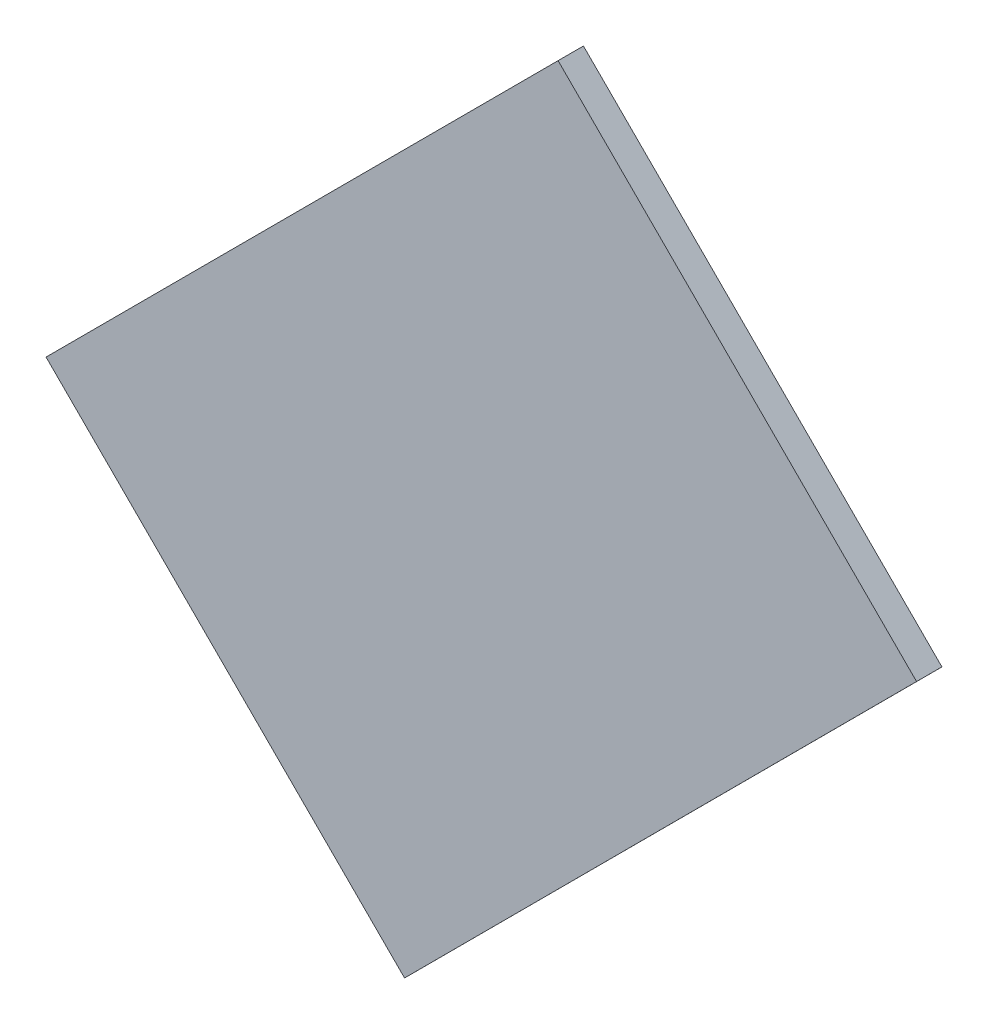
ISO-10303-21;
HEADER;
FILE_DESCRIPTION(('STEP AP214'),'2;1');
FILE_NAME('part.step','',(''),(''),'','','');
FILE_SCHEMA(('AUTOMOTIVE_DESIGN { 1 0 10303 214 1 1 1 1 }'));
ENDSEC;
DATA;
#1=APPLICATION_CONTEXT('core data for automotive mechanical design processes');
#2=APPLICATION_PROTOCOL_DEFINITION('international standard','automotive_design',2000,#1);
#3=PRODUCT_CONTEXT('',#1,'mechanical');
#4=PRODUCT('Part','Part','',(#3));
#5=PRODUCT_RELATED_PRODUCT_CATEGORY('part','',(#4));
#6=PRODUCT_DEFINITION_FORMATION('','',#4);
#7=PRODUCT_DEFINITION_CONTEXT('part definition',#1,'design');
#8=PRODUCT_DEFINITION('design','',#6,#7);
#9=PRODUCT_DEFINITION_SHAPE('','',#8);
#10=(LENGTH_UNIT() NAMED_UNIT(*) SI_UNIT(.MILLI.,.METRE.));
#11=(NAMED_UNIT(*) PLANE_ANGLE_UNIT() SI_UNIT($,.RADIAN.));
#12=(NAMED_UNIT(*) SI_UNIT($,.STERADIAN.) SOLID_ANGLE_UNIT());
#13=UNCERTAINTY_MEASURE_WITH_UNIT(LENGTH_MEASURE(1.E-05),#10,'distance_accuracy_value','');
#14=(GEOMETRIC_REPRESENTATION_CONTEXT(3) GLOBAL_UNCERTAINTY_ASSIGNED_CONTEXT((#13)) GLOBAL_UNIT_ASSIGNED_CONTEXT((#10,
#11,#12)) REPRESENTATION_CONTEXT('',''));
#15=CARTESIAN_POINT('',(0.,0.,0.));
#16=DIRECTION('',(0.,0.,1.));
#17=DIRECTION('',(1.,0.,0.));
#18=AXIS2_PLACEMENT_3D('',#15,#16,#17);
#19=CARTESIAN_POINT('',(858.207,760.828,0.));
#20=DIRECTION('',(-0.707606326588406,0.706606882624322,0.));
#21=DIRECTION('',(0.706606882624322,0.707606326588406,0.));
#22=AXIS2_PLACEMENT_3D('',#19,#20,#21);
#23=PLANE('',#22);
#24=DIRECTION('',(0.706606882624322,0.707606326588406,0.));
#25=VECTOR('',#24,1.);
#26=CARTESIAN_POINT('',(858.207,760.828,0.0350012));
#27=LINE('',#26,#25);
#28=CARTESIAN_POINT('',(858.207,760.828,0.0350012));
#29=VERTEX_POINT('',#28);
#30=CARTESIAN_POINT('',(858.914,761.536,0.0350012));
#31=VERTEX_POINT('',#30);
#32=EDGE_CURVE('E11',#29,#31,#27,.T.);
#33=ORIENTED_EDGE('',*,*,#32,.F.);
#34=DIRECTION('',(0.,0.,1.));
#35=VECTOR('',#34,1.);
#36=CARTESIAN_POINT('',(858.207,760.828,0.));
#37=LINE('',#36,#35);
#38=CARTESIAN_POINT('',(858.207,760.828,0.));
#39=VERTEX_POINT('',#38);
#40=EDGE_CURVE('E24',#39,#29,#37,.T.);
#41=ORIENTED_EDGE('',*,*,#40,.F.);
#42=DIRECTION('',(0.706606882624322,0.707606326588406,0.));
#43=VECTOR('',#42,1.);
#44=CARTESIAN_POINT('',(858.207,760.828,0.));
#45=LINE('',#44,#43);
#46=CARTESIAN_POINT('',(858.914,761.536,0.));
#47=VERTEX_POINT('',#46);
#48=EDGE_CURVE('E75',#39,#47,#45,.T.);
#49=ORIENTED_EDGE('',*,*,#48,.T.);
#50=DIRECTION('',(0.,0.,1.));
#51=VECTOR('',#50,1.);
#52=CARTESIAN_POINT('',(858.914,761.536,0.));
#53=LINE('',#52,#51);
#54=EDGE_CURVE('E37',#47,#31,#53,.T.);
#55=ORIENTED_EDGE('',*,*,#54,.T.);
#56=EDGE_LOOP('',(#33,#41,#49,#55));
#57=FACE_BOUND('',#56,.T.);
#58=ADVANCED_FACE('F17',(#57),#23,.F.);
#59=CARTESIAN_POINT('',(858.914,761.536,0.));
#60=DIRECTION('',(-0.707106781186548,-0.707106781186548,0.));
#61=DIRECTION('',(-0.707106781186548,0.707106781186548,0.));
#62=AXIS2_PLACEMENT_3D('',#59,#60,#61);
#63=PLANE('',#62);
#64=DIRECTION('',(-0.707106781186548,0.707106781186548,0.));
#65=VECTOR('',#64,1.);
#66=CARTESIAN_POINT('',(858.914,761.536,0.0350012));
#67=LINE('',#66,#65);
#68=CARTESIAN_POINT('',(858.419,762.031,0.0350012));
#69=VERTEX_POINT('',#68);
#70=EDGE_CURVE('E83',#31,#69,#67,.T.);
#71=ORIENTED_EDGE('',*,*,#70,.F.);
#72=ORIENTED_EDGE('',*,*,#54,.F.);
#73=DIRECTION('',(-0.707106781186548,0.707106781186548,0.));
#74=VECTOR('',#73,1.);
#75=CARTESIAN_POINT('',(858.914,761.536,0.));
#76=LINE('',#75,#74);
#77=CARTESIAN_POINT('',(858.419,762.031,0.));
#78=VERTEX_POINT('',#77);
#79=EDGE_CURVE('E81',#47,#78,#76,.T.);
#80=ORIENTED_EDGE('',*,*,#79,.T.);
#81=DIRECTION('',(0.,0.,1.));
#82=VECTOR('',#81,1.);
#83=CARTESIAN_POINT('',(858.419,762.031,0.));
#84=LINE('',#83,#82);
#85=EDGE_CURVE('E67',#78,#69,#84,.T.);
#86=ORIENTED_EDGE('',*,*,#85,.T.);
#87=EDGE_LOOP('',(#71,#72,#80,#86));
#88=FACE_BOUND('',#87,.T.);
#89=ADVANCED_FACE('F89',(#88),#63,.F.);
#90=CARTESIAN_POINT('',(858.419,762.031,0.));
#91=DIRECTION('',(0.707606326588406,-0.706606882624322,0.));
#92=DIRECTION('',(-0.706606882624322,-0.707606326588406,0.));
#93=AXIS2_PLACEMENT_3D('',#90,#91,#92);
#94=PLANE('',#93);
#95=DIRECTION('',(-0.706606882624322,-0.707606326588406,0.));
#96=VECTOR('',#95,1.);
#97=CARTESIAN_POINT('',(858.419,762.031,0.0350012));
#98=LINE('',#97,#96);
#99=CARTESIAN_POINT('',(857.712,761.323,0.0350012));
#100=VERTEX_POINT('',#99);
#101=EDGE_CURVE('E71',#69,#100,#98,.T.);
#102=ORIENTED_EDGE('',*,*,#101,.F.);
#103=ORIENTED_EDGE('',*,*,#85,.F.);
#104=DIRECTION('',(-0.706606882624322,-0.707606326588406,0.));
#105=VECTOR('',#104,1.);
#106=CARTESIAN_POINT('',(858.419,762.031,0.));
#107=LINE('',#106,#105);
#108=CARTESIAN_POINT('',(857.712,761.323,0.));
#109=VERTEX_POINT('',#108);
#110=EDGE_CURVE('E63',#78,#109,#107,.T.);
#111=ORIENTED_EDGE('',*,*,#110,.T.);
#112=DIRECTION('',(0.,0.,1.));
#113=VECTOR('',#112,1.);
#114=CARTESIAN_POINT('',(857.712,761.323,0.));
#115=LINE('',#114,#113);
#116=EDGE_CURVE('E53',#109,#100,#115,.T.);
#117=ORIENTED_EDGE('',*,*,#116,.T.);
#118=EDGE_LOOP('',(#102,#103,#111,#117));
#119=FACE_BOUND('',#118,.T.);
#120=ADVANCED_FACE('F66',(#119),#94,.F.);
#121=CARTESIAN_POINT('',(857.712,761.323,0.));
#122=DIRECTION('',(0.707106781186548,0.707106781186548,0.));
#123=DIRECTION('',(0.707106781186548,-0.707106781186548,0.));
#124=AXIS2_PLACEMENT_3D('',#121,#122,#123);
#125=PLANE('',#124);
#126=DIRECTION('',(0.707106781186548,-0.707106781186548,0.));
#127=VECTOR('',#126,1.);
#128=CARTESIAN_POINT('',(857.712,761.323,0.0350012));
#129=LINE('',#128,#127);
#130=EDGE_CURVE('E59',#100,#29,#129,.T.);
#131=ORIENTED_EDGE('',*,*,#130,.F.);
#132=ORIENTED_EDGE('',*,*,#116,.F.);
#133=DIRECTION('',(0.707106781186548,-0.707106781186548,0.));
#134=VECTOR('',#133,1.);
#135=CARTESIAN_POINT('',(857.712,761.323,0.));
#136=LINE('',#135,#134);
#137=EDGE_CURVE('E57',#109,#39,#136,.T.);
#138=ORIENTED_EDGE('',*,*,#137,.T.);
#139=ORIENTED_EDGE('',*,*,#40,.T.);
#140=EDGE_LOOP('',(#131,#132,#138,#139));
#141=FACE_BOUND('',#140,.T.);
#142=ADVANCED_FACE('F55',(#141),#125,.F.);
#143=CARTESIAN_POINT('',(858.313,761.4295,0.));
#144=DIRECTION('',(0.,0.,1.));
#145=DIRECTION('',(1.,0.,0.));
#146=AXIS2_PLACEMENT_3D('',#143,#144,#145);
#147=PLANE('',#146);
#148=ORIENTED_EDGE('',*,*,#137,.F.);
#149=ORIENTED_EDGE('',*,*,#110,.F.);
#150=ORIENTED_EDGE('',*,*,#79,.F.);
#151=ORIENTED_EDGE('',*,*,#48,.F.);
#152=EDGE_LOOP('',(#148,#149,#150,#151));
#153=FACE_BOUND('',#152,.T.);
#154=ADVANCED_FACE('F74',(#153),#147,.F.);
#155=CARTESIAN_POINT('',(858.313,761.4295,0.0350012));
#156=DIRECTION('',(0.,0.,1.));
#157=DIRECTION('',(1.,0.,0.));
#158=AXIS2_PLACEMENT_3D('',#155,#156,#157);
#159=PLANE('',#158);
#160=ORIENTED_EDGE('',*,*,#32,.T.);
#161=ORIENTED_EDGE('',*,*,#70,.T.);
#162=ORIENTED_EDGE('',*,*,#101,.T.);
#163=ORIENTED_EDGE('',*,*,#130,.T.);
#164=EDGE_LOOP('',(#160,#161,#162,#163));
#165=FACE_BOUND('',#164,.T.);
#166=ADVANCED_FACE('F91',(#165),#159,.T.);
#167=CLOSED_SHELL('',(#58,#89,#120,#142,#154,#166));
#168=MANIFOLD_SOLID_BREP('B1',#167);
#169=ADVANCED_BREP_SHAPE_REPRESENTATION('',(#18,#168),#14);
#170=SHAPE_DEFINITION_REPRESENTATION(#9,#169);
ENDSEC;
END-ISO-10303-21;
